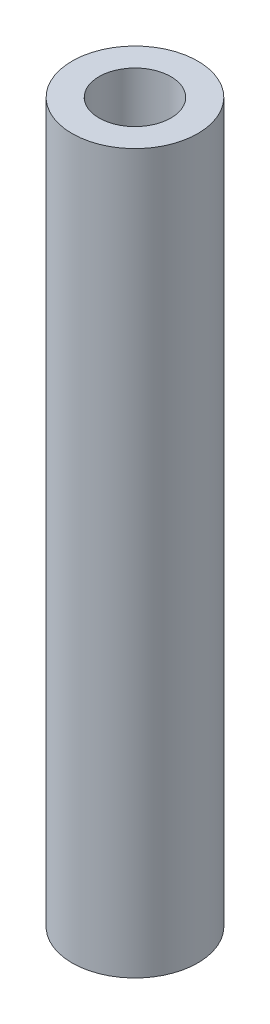
ISO-10303-21;
HEADER;
FILE_DESCRIPTION(('STEP AP214'),'2;1');
FILE_NAME('part.step','',(''),(''),'','','');
FILE_SCHEMA(('AUTOMOTIVE_DESIGN { 1 0 10303 214 1 1 1 1 }'));
ENDSEC;
DATA;
#1=APPLICATION_CONTEXT('core data for automotive mechanical design processes');
#2=APPLICATION_PROTOCOL_DEFINITION('international standard','automotive_design',2000,#1);
#3=PRODUCT_CONTEXT('',#1,'mechanical');
#4=PRODUCT('Part','Part','',(#3));
#5=PRODUCT_RELATED_PRODUCT_CATEGORY('part','',(#4));
#6=PRODUCT_DEFINITION_FORMATION('','',#4);
#7=PRODUCT_DEFINITION_CONTEXT('part definition',#1,'design');
#8=PRODUCT_DEFINITION('design','',#6,#7);
#9=PRODUCT_DEFINITION_SHAPE('','',#8);
#10=(LENGTH_UNIT() NAMED_UNIT(*) SI_UNIT(.MILLI.,.METRE.));
#11=(NAMED_UNIT(*) PLANE_ANGLE_UNIT() SI_UNIT($,.RADIAN.));
#12=(NAMED_UNIT(*) SI_UNIT($,.STERADIAN.) SOLID_ANGLE_UNIT());
#13=UNCERTAINTY_MEASURE_WITH_UNIT(LENGTH_MEASURE(1.E-05),#10,'distance_accuracy_value','');
#14=(GEOMETRIC_REPRESENTATION_CONTEXT(3) GLOBAL_UNCERTAINTY_ASSIGNED_CONTEXT((#13)) GLOBAL_UNIT_ASSIGNED_CONTEXT((#10,
#11,#12)) REPRESENTATION_CONTEXT('',''));
#15=CARTESIAN_POINT('',(0.,0.,0.));
#16=DIRECTION('',(0.,0.,1.));
#17=DIRECTION('',(1.,0.,0.));
#18=AXIS2_PLACEMENT_3D('',#15,#16,#17);
#19=CARTESIAN_POINT('',(0.,50.8,0.));
#20=DIRECTION('',(0.,1.,0.));
#21=DIRECTION('',(0.,0.,1.));
#22=AXIS2_PLACEMENT_3D('',#19,#20,#21);
#23=PLANE('',#22);
#24=CARTESIAN_POINT('',(0.,50.8,0.));
#25=DIRECTION('',(0.,1.,0.));
#26=DIRECTION('',(0.,0.,1.));
#27=AXIS2_PLACEMENT_3D('',#24,#25,#26);
#28=CIRCLE('',#27,4.445);
#29=CARTESIAN_POINT('',(0.,50.8,4.445));
#30=VERTEX_POINT('',#29);
#31=EDGE_CURVE('E10',#30,#30,#28,.T.);
#32=ORIENTED_EDGE('',*,*,#31,.T.);
#33=EDGE_LOOP('',(#32));
#34=FACE_BOUND('',#33,.T.);
#35=CARTESIAN_POINT('',(0.,50.8,0.));
#36=DIRECTION('',(0.,1.,0.));
#37=DIRECTION('',(0.,0.,1.));
#38=AXIS2_PLACEMENT_3D('',#35,#36,#37);
#39=CIRCLE('',#38,2.54);
#40=CARTESIAN_POINT('',(0.,50.8,2.54));
#41=VERTEX_POINT('',#40);
#42=EDGE_CURVE('E46',#41,#41,#39,.T.);
#43=ORIENTED_EDGE('',*,*,#42,.F.);
#44=EDGE_LOOP('',(#43));
#45=FACE_BOUND('',#44,.T.);
#46=ADVANCED_FACE('F35',(#34,#45),#23,.T.);
#47=CARTESIAN_POINT('',(0.,0.,0.));
#48=DIRECTION('',(0.,1.,0.));
#49=DIRECTION('',(0.,0.,1.));
#50=AXIS2_PLACEMENT_3D('',#47,#48,#49);
#51=PLANE('',#50);
#52=CARTESIAN_POINT('',(0.,0.,0.));
#53=DIRECTION('',(0.,1.,0.));
#54=DIRECTION('',(0.,0.,1.));
#55=AXIS2_PLACEMENT_3D('',#52,#53,#54);
#56=CIRCLE('',#55,4.445);
#57=CARTESIAN_POINT('',(0.,0.,4.445));
#58=VERTEX_POINT('',#57);
#59=EDGE_CURVE('E39',#58,#58,#56,.T.);
#60=ORIENTED_EDGE('',*,*,#59,.F.);
#61=EDGE_LOOP('',(#60));
#62=FACE_BOUND('',#61,.T.);
#63=CARTESIAN_POINT('',(0.,0.,0.));
#64=DIRECTION('',(0.,1.,0.));
#65=DIRECTION('',(0.,0.,1.));
#66=AXIS2_PLACEMENT_3D('',#63,#64,#65);
#67=CIRCLE('',#66,2.54);
#68=CARTESIAN_POINT('',(0.,0.,2.54));
#69=VERTEX_POINT('',#68);
#70=EDGE_CURVE('E48',#69,#69,#67,.T.);
#71=ORIENTED_EDGE('',*,*,#70,.T.);
#72=EDGE_LOOP('',(#71));
#73=FACE_BOUND('',#72,.T.);
#74=ADVANCED_FACE('F58',(#62,#73),#51,.F.);
#75=CARTESIAN_POINT('',(0.,50.8,0.));
#76=DIRECTION('',(0.,-1.,0.));
#77=DIRECTION('',(0.,0.,-1.));
#78=AXIS2_PLACEMENT_3D('',#75,#76,#77);
#79=CYLINDRICAL_SURFACE('',#78,4.445);
#80=ORIENTED_EDGE('',*,*,#31,.F.);
#81=EDGE_LOOP('',(#80));
#82=FACE_BOUND('',#81,.T.);
#83=ORIENTED_EDGE('',*,*,#59,.T.);
#84=EDGE_LOOP('',(#83));
#85=FACE_BOUND('',#84,.T.);
#86=ADVANCED_FACE('F37',(#82,#85),#79,.T.);
#87=CARTESIAN_POINT('',(0.,50.8,0.));
#88=DIRECTION('',(0.,-1.,0.));
#89=DIRECTION('',(0.,0.,-1.));
#90=AXIS2_PLACEMENT_3D('',#87,#88,#89);
#91=CYLINDRICAL_SURFACE('',#90,2.54);
#92=ORIENTED_EDGE('',*,*,#42,.T.);
#93=EDGE_LOOP('',(#92));
#94=FACE_BOUND('',#93,.T.);
#95=ORIENTED_EDGE('',*,*,#70,.F.);
#96=EDGE_LOOP('',(#95));
#97=FACE_BOUND('',#96,.T.);
#98=ADVANCED_FACE('F54',(#94,#97),#91,.F.);
#99=CLOSED_SHELL('',(#46,#74,#86,#98));
#100=MANIFOLD_SOLID_BREP('B2',#99);
#101=ADVANCED_BREP_SHAPE_REPRESENTATION('',(#18,#100),#14);
#102=SHAPE_DEFINITION_REPRESENTATION(#9,#101);
ENDSEC;
END-ISO-10303-21;
